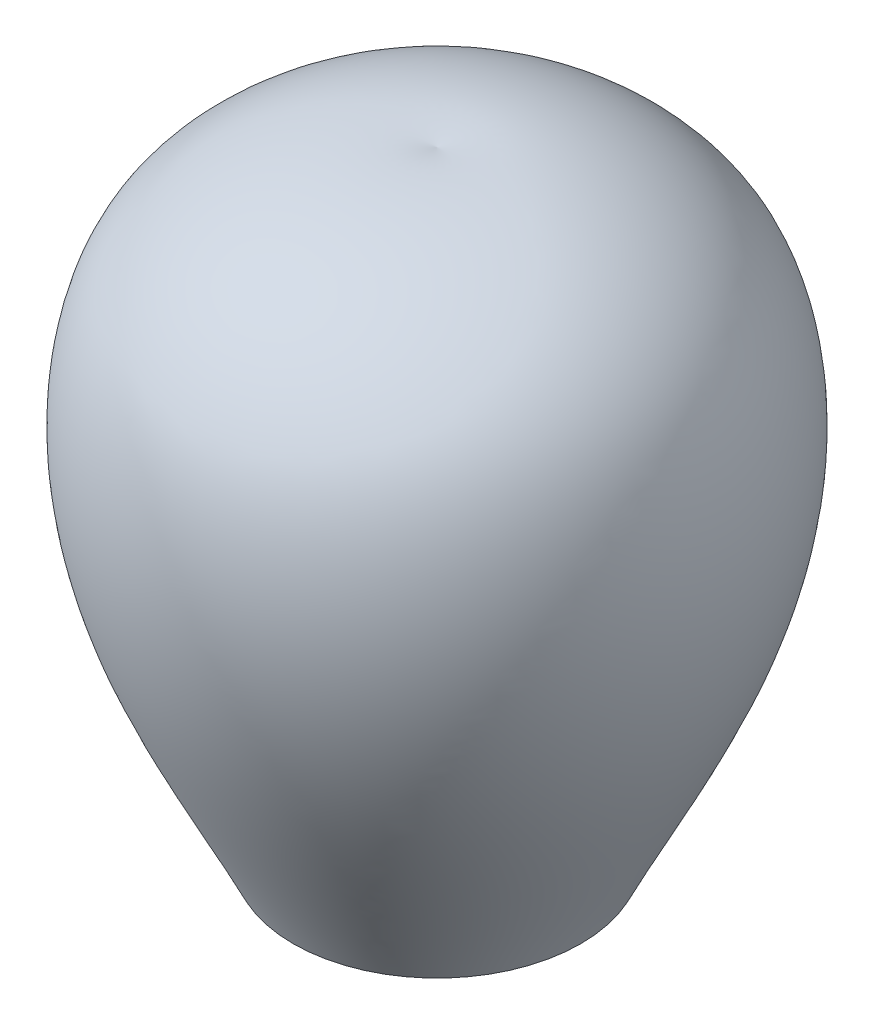
ISO-10303-21;
HEADER;
FILE_DESCRIPTION(('STEP AP214'),'2;1');
FILE_NAME('part.step','',(''),(''),'','','');
FILE_SCHEMA(('AUTOMOTIVE_DESIGN { 1 0 10303 214 1 1 1 1 }'));
ENDSEC;
DATA;
#1=APPLICATION_CONTEXT('core data for automotive mechanical design processes');
#2=APPLICATION_PROTOCOL_DEFINITION('international standard','automotive_design',2000,#1);
#3=PRODUCT_CONTEXT('',#1,'mechanical');
#4=PRODUCT('Part','Part','',(#3));
#5=PRODUCT_RELATED_PRODUCT_CATEGORY('part','',(#4));
#6=PRODUCT_DEFINITION_FORMATION('','',#4);
#7=PRODUCT_DEFINITION_CONTEXT('part definition',#1,'design');
#8=PRODUCT_DEFINITION('design','',#6,#7);
#9=PRODUCT_DEFINITION_SHAPE('','',#8);
#10=(LENGTH_UNIT() NAMED_UNIT(*) SI_UNIT(.MILLI.,.METRE.));
#11=(NAMED_UNIT(*) PLANE_ANGLE_UNIT() SI_UNIT($,.RADIAN.));
#12=(NAMED_UNIT(*) SI_UNIT($,.STERADIAN.) SOLID_ANGLE_UNIT());
#13=UNCERTAINTY_MEASURE_WITH_UNIT(LENGTH_MEASURE(1.E-05),#10,'distance_accuracy_value','');
#14=(GEOMETRIC_REPRESENTATION_CONTEXT(3) GLOBAL_UNCERTAINTY_ASSIGNED_CONTEXT((#13)) GLOBAL_UNIT_ASSIGNED_CONTEXT((#10,
#11,#12)) REPRESENTATION_CONTEXT('',''));
#15=CARTESIAN_POINT('',(0.,0.,0.));
#16=DIRECTION('',(0.,0.,1.));
#17=DIRECTION('',(1.,0.,0.));
#18=AXIS2_PLACEMENT_3D('',#15,#16,#17);
#19=CARTESIAN_POINT('',(0.,13.716908951798,0.));
#20=CARTESIAN_POINT('',(-3.03000241700938,14.2393454359639,0.));
#21=CARTESIAN_POINT('',(-8.08167003058056,12.3505678921349,0.));
#22=CARTESIAN_POINT('',(-9.99501989438956,5.7924159936422,0.));
#23=CARTESIAN_POINT('',(-8.92558256880963,-0.663122306252884,0.));
#24=CARTESIAN_POINT('',(-6.2428715956012,-5.19333997285621,0.));
#25=CARTESIAN_POINT('',(-5.,-7.76740627390973,0.));
#26=B_SPLINE_CURVE_WITH_KNOTS('',3,(#19,#20,#21,#22,#23,#24,#25),.UNSPECIFIED.,.F.,.F.,(4,1,1,1,
4),(0.,0.337005827408854,0.447194855397402,0.698598688458985,1.),.UNSPECIFIED.);
#27=CARTESIAN_POINT('',(0.,16.3611323641928,0.));
#28=DIRECTION('',(0.,1.,0.));
#29=AXIS1_PLACEMENT('',#27,#28);
#30=SURFACE_OF_REVOLUTION('',#26,#29);
#31=CARTESIAN_POINT('',(0.,-7.76740627390973,0.));
#32=DIRECTION('',(0.,1.,0.));
#33=DIRECTION('',(0.,0.,1.));
#34=AXIS2_PLACEMENT_3D('',#31,#32,#33);
#35=CIRCLE('',#34,5.);
#36=CARTESIAN_POINT('',(0.,-7.76740627390973,5.));
#37=VERTEX_POINT('',#36);
#38=EDGE_CURVE('E11',#37,#37,#35,.T.);
#39=ORIENTED_EDGE('',*,*,#38,.T.);
#40=EDGE_LOOP('',(#39));
#41=FACE_BOUND('',#40,.T.);
#42=CARTESIAN_POINT('',(0.,13.716908951798,0.));
#43=VERTEX_POINT('',#42);
#44=VERTEX_LOOP('',#43);
#45=FACE_BOUND('',#44,.T.);
#46=ADVANCED_FACE('F41',(#41,#45),#30,.F.);
#47=CARTESIAN_POINT('',(0.,-7.76740627390973,0.));
#48=DIRECTION('',(0.,-1.,0.));
#49=DIRECTION('',(0.,0.,-1.));
#50=AXIS2_PLACEMENT_3D('',#47,#48,#49);
#51=PLANE('',#50);
#52=ORIENTED_EDGE('',*,*,#38,.F.);
#53=EDGE_LOOP('',(#52));
#54=FACE_BOUND('',#53,.T.);
#55=ADVANCED_FACE('F50',(#54),#51,.T.);
#56=CLOSED_SHELL('',(#46,#55));
#57=MANIFOLD_SOLID_BREP('B2',#56);
#58=ADVANCED_BREP_SHAPE_REPRESENTATION('',(#18,#57),#14);
#59=SHAPE_DEFINITION_REPRESENTATION(#9,#58);
ENDSEC;
END-ISO-10303-21;
